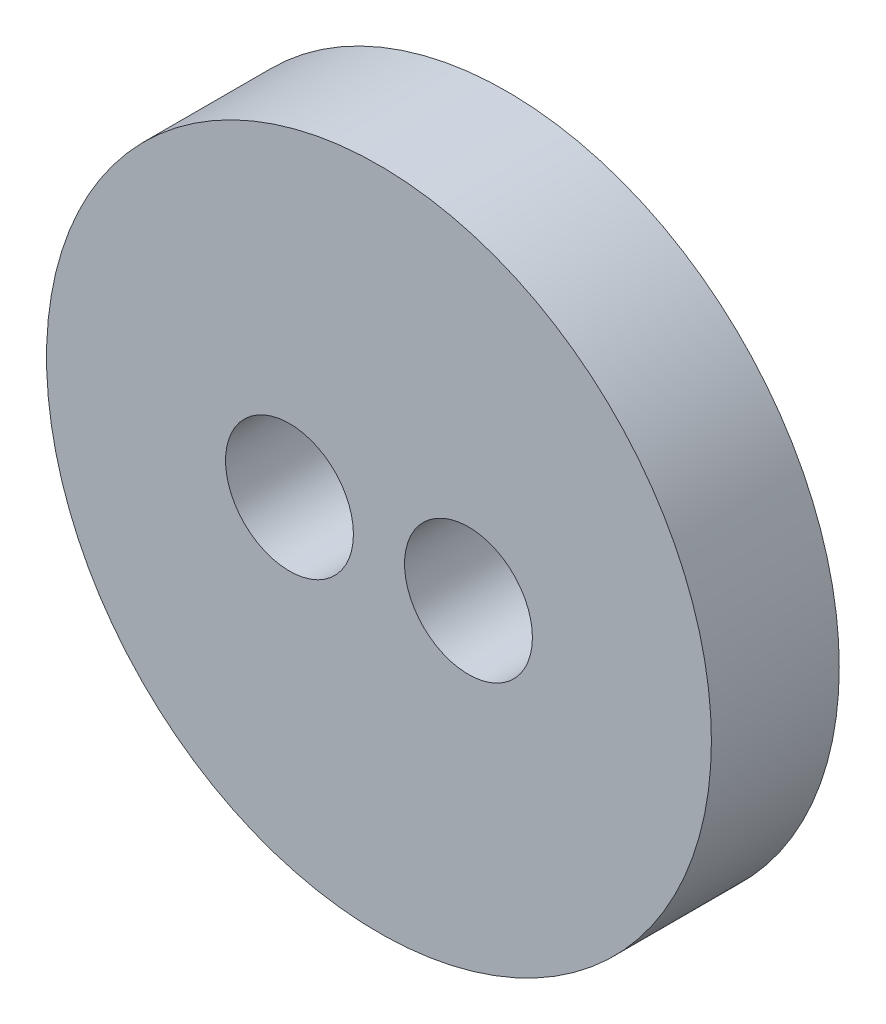
ISO-10303-21;
HEADER;
FILE_DESCRIPTION(('STEP AP214'),'2;1');
FILE_NAME('part.step','',(''),(''),'','','');
FILE_SCHEMA(('AUTOMOTIVE_DESIGN { 1 0 10303 214 1 1 1 1 }'));
ENDSEC;
DATA;
#1=APPLICATION_CONTEXT('core data for automotive mechanical design processes');
#2=APPLICATION_PROTOCOL_DEFINITION('international standard','automotive_design',2000,#1);
#3=PRODUCT_CONTEXT('',#1,'mechanical');
#4=PRODUCT('Part','Part','',(#3));
#5=PRODUCT_RELATED_PRODUCT_CATEGORY('part','',(#4));
#6=PRODUCT_DEFINITION_FORMATION('','',#4);
#7=PRODUCT_DEFINITION_CONTEXT('part definition',#1,'design');
#8=PRODUCT_DEFINITION('design','',#6,#7);
#9=PRODUCT_DEFINITION_SHAPE('','',#8);
#10=(LENGTH_UNIT() NAMED_UNIT(*) SI_UNIT(.MILLI.,.METRE.));
#11=(NAMED_UNIT(*) PLANE_ANGLE_UNIT() SI_UNIT($,.RADIAN.));
#12=(NAMED_UNIT(*) SI_UNIT($,.STERADIAN.) SOLID_ANGLE_UNIT());
#13=UNCERTAINTY_MEASURE_WITH_UNIT(LENGTH_MEASURE(1.E-05),#10,'distance_accuracy_value','');
#14=(GEOMETRIC_REPRESENTATION_CONTEXT(3) GLOBAL_UNCERTAINTY_ASSIGNED_CONTEXT((#13)) GLOBAL_UNIT_ASSIGNED_CONTEXT((#10,
#11,#12)) REPRESENTATION_CONTEXT('',''));
#15=CARTESIAN_POINT('',(0.,0.,0.));
#16=DIRECTION('',(0.,0.,1.));
#17=DIRECTION('',(1.,0.,0.));
#18=AXIS2_PLACEMENT_3D('',#15,#16,#17);
#19=CARTESIAN_POINT('',(0.,0.,-2.));
#20=DIRECTION('',(0.,0.,-1.));
#21=DIRECTION('',(1.,0.,0.));
#22=AXIS2_PLACEMENT_3D('',#19,#20,#21);
#23=PLANE('',#22);
#24=CARTESIAN_POINT('',(1.4,0.,-2.));
#25=DIRECTION('',(0.,0.,1.));
#26=DIRECTION('',(1.,0.,0.));
#27=AXIS2_PLACEMENT_3D('',#24,#25,#26);
#28=CIRCLE('',#27,1.);
#29=CARTESIAN_POINT('',(2.4,0.,-2.));
#30=VERTEX_POINT('',#29);
#31=EDGE_CURVE('E54',#30,#30,#28,.T.);
#32=ORIENTED_EDGE('',*,*,#31,.T.);
#33=EDGE_LOOP('',(#32));
#34=FACE_BOUND('',#33,.T.);
#35=CARTESIAN_POINT('',(0.,0.,-2.));
#36=DIRECTION('',(0.,0.,1.));
#37=DIRECTION('',(1.,0.,0.));
#38=AXIS2_PLACEMENT_3D('',#35,#36,#37);
#39=CIRCLE('',#38,5.2);
#40=CARTESIAN_POINT('',(5.2,0.,-2.));
#41=VERTEX_POINT('',#40);
#42=EDGE_CURVE('E10',#41,#41,#39,.T.);
#43=ORIENTED_EDGE('',*,*,#42,.F.);
#44=EDGE_LOOP('',(#43));
#45=FACE_BOUND('',#44,.T.);
#46=CARTESIAN_POINT('',(-1.4,0.,-2.));
#47=DIRECTION('',(0.,0.,1.));
#48=DIRECTION('',(1.,0.,0.));
#49=AXIS2_PLACEMENT_3D('',#46,#47,#48);
#50=CIRCLE('',#49,1.);
#51=CARTESIAN_POINT('',(-0.4,0.,-2.));
#52=VERTEX_POINT('',#51);
#53=EDGE_CURVE('E59',#52,#52,#50,.T.);
#54=ORIENTED_EDGE('',*,*,#53,.T.);
#55=EDGE_LOOP('',(#54));
#56=FACE_BOUND('',#55,.T.);
#57=ADVANCED_FACE('F43',(#34,#45,#56),#23,.T.);
#58=CARTESIAN_POINT('',(0.,0.,0.));
#59=DIRECTION('',(0.,0.,-1.));
#60=DIRECTION('',(1.,0.,0.));
#61=AXIS2_PLACEMENT_3D('',#58,#59,#60);
#62=PLANE('',#61);
#63=CARTESIAN_POINT('',(0.,0.,0.));
#64=DIRECTION('',(0.,0.,1.));
#65=DIRECTION('',(1.,0.,0.));
#66=AXIS2_PLACEMENT_3D('',#63,#64,#65);
#67=CIRCLE('',#66,5.2);
#68=CARTESIAN_POINT('',(5.2,0.,0.));
#69=VERTEX_POINT('',#68);
#70=EDGE_CURVE('E47',#69,#69,#67,.T.);
#71=ORIENTED_EDGE('',*,*,#70,.T.);
#72=EDGE_LOOP('',(#71));
#73=FACE_BOUND('',#72,.T.);
#74=CARTESIAN_POINT('',(1.4,0.,0.));
#75=DIRECTION('',(0.,0.,1.));
#76=DIRECTION('',(1.,0.,0.));
#77=AXIS2_PLACEMENT_3D('',#74,#75,#76);
#78=CIRCLE('',#77,1.);
#79=CARTESIAN_POINT('',(2.4,0.,0.));
#80=VERTEX_POINT('',#79);
#81=EDGE_CURVE('E56',#80,#80,#78,.T.);
#82=ORIENTED_EDGE('',*,*,#81,.F.);
#83=EDGE_LOOP('',(#82));
#84=FACE_BOUND('',#83,.T.);
#85=CARTESIAN_POINT('',(-1.4,0.,0.));
#86=DIRECTION('',(0.,0.,1.));
#87=DIRECTION('',(1.,0.,0.));
#88=AXIS2_PLACEMENT_3D('',#85,#86,#87);
#89=CIRCLE('',#88,1.);
#90=CARTESIAN_POINT('',(-0.4,0.,0.));
#91=VERTEX_POINT('',#90);
#92=EDGE_CURVE('E62',#91,#91,#89,.T.);
#93=ORIENTED_EDGE('',*,*,#92,.F.);
#94=EDGE_LOOP('',(#93));
#95=FACE_BOUND('',#94,.T.);
#96=ADVANCED_FACE('F76',(#73,#84,#95),#62,.F.);
#97=CARTESIAN_POINT('',(0.,0.,-2.));
#98=DIRECTION('',(0.,0.,1.));
#99=DIRECTION('',(-1.,0.,0.));
#100=AXIS2_PLACEMENT_3D('',#97,#98,#99);
#101=CYLINDRICAL_SURFACE('',#100,5.2);
#102=ORIENTED_EDGE('',*,*,#42,.T.);
#103=EDGE_LOOP('',(#102));
#104=FACE_BOUND('',#103,.T.);
#105=ORIENTED_EDGE('',*,*,#70,.F.);
#106=EDGE_LOOP('',(#105));
#107=FACE_BOUND('',#106,.T.);
#108=ADVANCED_FACE('F45',(#104,#107),#101,.T.);
#109=CARTESIAN_POINT('',(1.4,0.,-2.));
#110=DIRECTION('',(0.,0.,1.));
#111=DIRECTION('',(-1.,0.,0.));
#112=AXIS2_PLACEMENT_3D('',#109,#110,#111);
#113=CYLINDRICAL_SURFACE('',#112,1.);
#114=ORIENTED_EDGE('',*,*,#31,.F.);
#115=EDGE_LOOP('',(#114));
#116=FACE_BOUND('',#115,.T.);
#117=ORIENTED_EDGE('',*,*,#81,.T.);
#118=EDGE_LOOP('',(#117));
#119=FACE_BOUND('',#118,.T.);
#120=ADVANCED_FACE('F72',(#116,#119),#113,.F.);
#121=CARTESIAN_POINT('',(-1.4,0.,-2.));
#122=DIRECTION('',(0.,0.,1.));
#123=DIRECTION('',(-1.,0.,0.));
#124=AXIS2_PLACEMENT_3D('',#121,#122,#123);
#125=CYLINDRICAL_SURFACE('',#124,1.);
#126=ORIENTED_EDGE('',*,*,#53,.F.);
#127=EDGE_LOOP('',(#126));
#128=FACE_BOUND('',#127,.T.);
#129=ORIENTED_EDGE('',*,*,#92,.T.);
#130=EDGE_LOOP('',(#129));
#131=FACE_BOUND('',#130,.T.);
#132=ADVANCED_FACE('F69',(#128,#131),#125,.F.);
#133=CLOSED_SHELL('',(#57,#96,#108,#120,#132));
#134=MANIFOLD_SOLID_BREP('B2',#133);
#135=ADVANCED_BREP_SHAPE_REPRESENTATION('',(#18,#134),#14);
#136=SHAPE_DEFINITION_REPRESENTATION(#9,#135);
ENDSEC;
END-ISO-10303-21;
